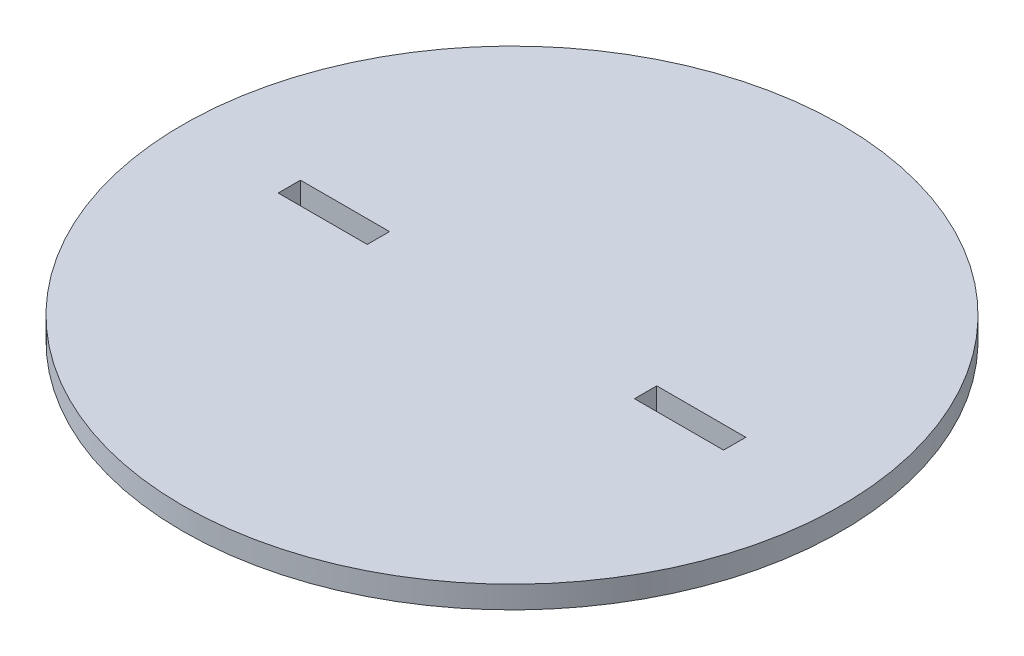
ISO-10303-21;
HEADER;
FILE_DESCRIPTION(('STEP AP214'),'2;1');
FILE_NAME('part.step','',(''),(''),'','','');
FILE_SCHEMA(('AUTOMOTIVE_DESIGN { 1 0 10303 214 1 1 1 1 }'));
ENDSEC;
DATA;
#1=APPLICATION_CONTEXT('core data for automotive mechanical design processes');
#2=APPLICATION_PROTOCOL_DEFINITION('international standard','automotive_design',2000,#1);
#3=PRODUCT_CONTEXT('',#1,'mechanical');
#4=PRODUCT('Part','Part','',(#3));
#5=PRODUCT_RELATED_PRODUCT_CATEGORY('part','',(#4));
#6=PRODUCT_DEFINITION_FORMATION('','',#4);
#7=PRODUCT_DEFINITION_CONTEXT('part definition',#1,'design');
#8=PRODUCT_DEFINITION('design','',#6,#7);
#9=PRODUCT_DEFINITION_SHAPE('','',#8);
#10=(LENGTH_UNIT() NAMED_UNIT(*) SI_UNIT(.MILLI.,.METRE.));
#11=(NAMED_UNIT(*) PLANE_ANGLE_UNIT() SI_UNIT($,.RADIAN.));
#12=(NAMED_UNIT(*) SI_UNIT($,.STERADIAN.) SOLID_ANGLE_UNIT());
#13=UNCERTAINTY_MEASURE_WITH_UNIT(LENGTH_MEASURE(1.E-05),#10,'distance_accuracy_value','');
#14=(GEOMETRIC_REPRESENTATION_CONTEXT(3) GLOBAL_UNCERTAINTY_ASSIGNED_CONTEXT((#13)) GLOBAL_UNIT_ASSIGNED_CONTEXT((#10,
#11,#12)) REPRESENTATION_CONTEXT('',''));
#15=CARTESIAN_POINT('',(0.,0.,0.));
#16=DIRECTION('',(0.,0.,1.));
#17=DIRECTION('',(1.,0.,0.));
#18=AXIS2_PLACEMENT_3D('',#15,#16,#17);
#19=CARTESIAN_POINT('',(0.,1.5875,0.));
#20=DIRECTION('',(0.,-1.,0.));
#21=DIRECTION('',(0.,0.,-1.));
#22=AXIS2_PLACEMENT_3D('',#19,#20,#21);
#23=CYLINDRICAL_SURFACE('',#22,23.495);
#24=CARTESIAN_POINT('',(0.,1.5875,0.));
#25=DIRECTION('',(0.,1.,0.));
#26=DIRECTION('',(0.,0.,1.));
#27=AXIS2_PLACEMENT_3D('',#24,#25,#26);
#28=CIRCLE('',#27,23.495);
#29=CARTESIAN_POINT('',(0.,1.5875,23.495));
#30=VERTEX_POINT('',#29);
#31=EDGE_CURVE('E11',#30,#30,#28,.T.);
#32=ORIENTED_EDGE('',*,*,#31,.F.);
#33=EDGE_LOOP('',(#32));
#34=FACE_BOUND('',#33,.T.);
#35=CARTESIAN_POINT('',(0.,0.,0.));
#36=DIRECTION('',(0.,1.,0.));
#37=DIRECTION('',(0.,0.,1.));
#38=AXIS2_PLACEMENT_3D('',#35,#36,#37);
#39=CIRCLE('',#38,23.495);
#40=CARTESIAN_POINT('',(0.,0.,23.495));
#41=VERTEX_POINT('',#40);
#42=EDGE_CURVE('E40',#41,#41,#39,.T.);
#43=ORIENTED_EDGE('',*,*,#42,.T.);
#44=EDGE_LOOP('',(#43));
#45=FACE_BOUND('',#44,.T.);
#46=ADVANCED_FACE('F37',(#34,#45),#23,.T.);
#47=CARTESIAN_POINT('',(0.,1.5875,0.));
#48=DIRECTION('',(0.,1.,0.));
#49=DIRECTION('',(0.,0.,1.));
#50=AXIS2_PLACEMENT_3D('',#47,#48,#49);
#51=PLANE('',#50);
#52=DIRECTION('',(0.,0.,1.));
#53=VECTOR('',#52,1.);
#54=CARTESIAN_POINT('',(9.52500000000001,1.5875,0.793749999999998));
#55=LINE('',#54,#53);
#56=CARTESIAN_POINT('',(9.52500000000001,1.5875,-0.793749999999998));
#57=VERTEX_POINT('',#56);
#58=CARTESIAN_POINT('',(9.52500000000001,1.5875,0.793749999999998));
#59=VERTEX_POINT('',#58);
#60=EDGE_CURVE('E51',#57,#59,#55,.T.);
#61=ORIENTED_EDGE('',*,*,#60,.F.);
#62=DIRECTION('',(-1.,0.,0.));
#63=VECTOR('',#62,1.);
#64=CARTESIAN_POINT('',(9.52500000000001,1.5875,-0.793749999999998));
#65=LINE('',#64,#63);
#66=CARTESIAN_POINT('',(15.875,1.5875,-0.793750000000001));
#67=VERTEX_POINT('',#66);
#68=EDGE_CURVE('E119',#67,#57,#65,.T.);
#69=ORIENTED_EDGE('',*,*,#68,.F.);
#70=DIRECTION('',(0.,0.,-1.));
#71=VECTOR('',#70,1.);
#72=CARTESIAN_POINT('',(15.875,1.5875,0.793750000000004));
#73=LINE('',#72,#71);
#74=CARTESIAN_POINT('',(15.875,1.5875,0.793750000000004));
#75=VERTEX_POINT('',#74);
#76=EDGE_CURVE('E122',#75,#67,#73,.T.);
#77=ORIENTED_EDGE('',*,*,#76,.F.);
#78=DIRECTION('',(1.,0.,0.));
#79=VECTOR('',#78,1.);
#80=CARTESIAN_POINT('',(9.52500000000001,1.5875,0.793749999999998));
#81=LINE('',#80,#79);
#82=EDGE_CURVE('E128',#59,#75,#81,.T.);
#83=ORIENTED_EDGE('',*,*,#82,.F.);
#84=EDGE_LOOP('',(#61,#69,#77,#83));
#85=FACE_BOUND('',#84,.T.);
#86=DIRECTION('',(0.,0.,-1.));
#87=VECTOR('',#86,1.);
#88=CARTESIAN_POINT('',(-9.52499999999999,1.5875,0.793749999999998));
#89=LINE('',#88,#87);
#90=CARTESIAN_POINT('',(-9.52499999999999,1.5875,0.793749999999998));
#91=VERTEX_POINT('',#90);
#92=CARTESIAN_POINT('',(-9.52499999999999,1.5875,-0.793749999999997));
#93=VERTEX_POINT('',#92);
#94=EDGE_CURVE('E134',#91,#93,#89,.T.);
#95=ORIENTED_EDGE('',*,*,#94,.F.);
#96=DIRECTION('',(1.,0.,0.));
#97=VECTOR('',#96,1.);
#98=CARTESIAN_POINT('',(-9.52499999999999,1.5875,0.793749999999998));
#99=LINE('',#98,#97);
#100=CARTESIAN_POINT('',(-15.875,1.5875,0.793749999999998));
#101=VERTEX_POINT('',#100);
#102=EDGE_CURVE('E142',#101,#91,#99,.T.);
#103=ORIENTED_EDGE('',*,*,#102,.F.);
#104=DIRECTION('',(0.,0.,1.));
#105=VECTOR('',#104,1.);
#106=CARTESIAN_POINT('',(-15.875,1.5875,0.793749999999998));
#107=LINE('',#106,#105);
#108=CARTESIAN_POINT('',(-15.875,1.5875,-0.793750000000001));
#109=VERTEX_POINT('',#108);
#110=EDGE_CURVE('E156',#109,#101,#107,.T.);
#111=ORIENTED_EDGE('',*,*,#110,.F.);
#112=DIRECTION('',(-1.,0.,0.));
#113=VECTOR('',#112,1.);
#114=CARTESIAN_POINT('',(-9.52499999999999,1.5875,-0.793749999999997));
#115=LINE('',#114,#113);
#116=EDGE_CURVE('E153',#93,#109,#115,.T.);
#117=ORIENTED_EDGE('',*,*,#116,.F.);
#118=EDGE_LOOP('',(#95,#103,#111,#117));
#119=FACE_BOUND('',#118,.T.);
#120=ORIENTED_EDGE('',*,*,#31,.T.);
#121=EDGE_LOOP('',(#120));
#122=FACE_BOUND('',#121,.T.);
#123=ADVANCED_FACE('F178',(#85,#119,#122),#51,.T.);
#124=CARTESIAN_POINT('',(0.,0.,0.));
#125=DIRECTION('',(0.,1.,0.));
#126=DIRECTION('',(0.,0.,1.));
#127=AXIS2_PLACEMENT_3D('',#124,#125,#126);
#128=PLANE('',#127);
#129=DIRECTION('',(-1.,0.,0.));
#130=VECTOR('',#129,1.);
#131=CARTESIAN_POINT('',(9.52500000000001,0.,-0.793749999999998));
#132=LINE('',#131,#130);
#133=CARTESIAN_POINT('',(15.875,0.,-0.793750000000001));
#134=VERTEX_POINT('',#133);
#135=CARTESIAN_POINT('',(9.52500000000001,0.,-0.793749999999998));
#136=VERTEX_POINT('',#135);
#137=EDGE_CURVE('E109',#134,#136,#132,.T.);
#138=ORIENTED_EDGE('',*,*,#137,.T.);
#139=DIRECTION('',(0.,0.,1.));
#140=VECTOR('',#139,1.);
#141=CARTESIAN_POINT('',(9.52500000000001,0.,0.793749999999998));
#142=LINE('',#141,#140);
#143=CARTESIAN_POINT('',(9.52500000000001,0.,0.793749999999998));
#144=VERTEX_POINT('',#143);
#145=EDGE_CURVE('E103',#136,#144,#142,.T.);
#146=ORIENTED_EDGE('',*,*,#145,.T.);
#147=DIRECTION('',(1.,0.,0.));
#148=VECTOR('',#147,1.);
#149=CARTESIAN_POINT('',(9.52500000000001,0.,0.793749999999998));
#150=LINE('',#149,#148);
#151=CARTESIAN_POINT('',(15.875,0.,0.793750000000004));
#152=VERTEX_POINT('',#151);
#153=EDGE_CURVE('E112',#144,#152,#150,.T.);
#154=ORIENTED_EDGE('',*,*,#153,.T.);
#155=DIRECTION('',(0.,0.,-1.));
#156=VECTOR('',#155,1.);
#157=CARTESIAN_POINT('',(15.875,0.,0.793750000000004));
#158=LINE('',#157,#156);
#159=EDGE_CURVE('E59',#152,#134,#158,.T.);
#160=ORIENTED_EDGE('',*,*,#159,.T.);
#161=EDGE_LOOP('',(#138,#146,#154,#160));
#162=FACE_BOUND('',#161,.T.);
#163=DIRECTION('',(1.,0.,0.));
#164=VECTOR('',#163,1.);
#165=CARTESIAN_POINT('',(-9.52499999999999,0.,0.793749999999998));
#166=LINE('',#165,#164);
#167=CARTESIAN_POINT('',(-15.875,0.,0.793749999999998));
#168=VERTEX_POINT('',#167);
#169=CARTESIAN_POINT('',(-9.52499999999999,0.,0.793749999999998));
#170=VERTEX_POINT('',#169);
#171=EDGE_CURVE('E148',#168,#170,#166,.T.);
#172=ORIENTED_EDGE('',*,*,#171,.T.);
#173=DIRECTION('',(0.,0.,-1.));
#174=VECTOR('',#173,1.);
#175=CARTESIAN_POINT('',(-9.52499999999999,0.,0.793749999999998));
#176=LINE('',#175,#174);
#177=CARTESIAN_POINT('',(-9.52499999999999,0.,-0.793749999999997));
#178=VERTEX_POINT('',#177);
#179=EDGE_CURVE('E138',#170,#178,#176,.T.);
#180=ORIENTED_EDGE('',*,*,#179,.T.);
#181=DIRECTION('',(-1.,0.,0.));
#182=VECTOR('',#181,1.);
#183=CARTESIAN_POINT('',(-9.52499999999999,0.,-0.793749999999997));
#184=LINE('',#183,#182);
#185=CARTESIAN_POINT('',(-15.875,0.,-0.793750000000001));
#186=VERTEX_POINT('',#185);
#187=EDGE_CURVE('E141',#178,#186,#184,.T.);
#188=ORIENTED_EDGE('',*,*,#187,.T.);
#189=DIRECTION('',(0.,0.,1.));
#190=VECTOR('',#189,1.);
#191=CARTESIAN_POINT('',(-15.875,0.,0.793749999999998));
#192=LINE('',#191,#190);
#193=EDGE_CURVE('E145',#186,#168,#192,.T.);
#194=ORIENTED_EDGE('',*,*,#193,.T.);
#195=EDGE_LOOP('',(#172,#180,#188,#194));
#196=FACE_BOUND('',#195,.T.);
#197=ORIENTED_EDGE('',*,*,#42,.F.);
#198=EDGE_LOOP('',(#197));
#199=FACE_BOUND('',#198,.T.);
#200=ADVANCED_FACE('F116',(#162,#196,#199),#128,.F.);
#201=CARTESIAN_POINT('',(-9.52499999999999,0.,0.793749999999998));
#202=DIRECTION('',(1.,0.,0.));
#203=DIRECTION('',(0.,0.,-1.));
#204=AXIS2_PLACEMENT_3D('',#201,#202,#203);
#205=PLANE('',#204);
#206=ORIENTED_EDGE('',*,*,#94,.T.);
#207=DIRECTION('',(0.,1.,0.));
#208=VECTOR('',#207,1.);
#209=CARTESIAN_POINT('',(-9.52499999999999,0.,-0.793749999999997));
#210=LINE('',#209,#208);
#211=EDGE_CURVE('E151',#178,#93,#210,.T.);
#212=ORIENTED_EDGE('',*,*,#211,.F.);
#213=ORIENTED_EDGE('',*,*,#179,.F.);
#214=DIRECTION('',(0.,1.,0.));
#215=VECTOR('',#214,1.);
#216=CARTESIAN_POINT('',(-9.52499999999999,0.,0.793749999999998));
#217=LINE('',#216,#215);
#218=EDGE_CURVE('E161',#170,#91,#217,.T.);
#219=ORIENTED_EDGE('',*,*,#218,.T.);
#220=EDGE_LOOP('',(#206,#212,#213,#219));
#221=FACE_BOUND('',#220,.T.);
#222=ADVANCED_FACE('F185',(#221),#205,.F.);
#223=CARTESIAN_POINT('',(-9.52499999999999,0.,0.793749999999998));
#224=DIRECTION('',(0.,0.,1.));
#225=DIRECTION('',(1.,0.,0.));
#226=AXIS2_PLACEMENT_3D('',#223,#224,#225);
#227=PLANE('',#226);
#228=ORIENTED_EDGE('',*,*,#102,.T.);
#229=ORIENTED_EDGE('',*,*,#218,.F.);
#230=ORIENTED_EDGE('',*,*,#171,.F.);
#231=DIRECTION('',(0.,1.,0.));
#232=VECTOR('',#231,1.);
#233=CARTESIAN_POINT('',(-15.875,0.,0.793749999999998));
#234=LINE('',#233,#232);
#235=EDGE_CURVE('E163',#168,#101,#234,.T.);
#236=ORIENTED_EDGE('',*,*,#235,.T.);
#237=EDGE_LOOP('',(#228,#229,#230,#236));
#238=FACE_BOUND('',#237,.T.);
#239=ADVANCED_FACE('F187',(#238),#227,.F.);
#240=CARTESIAN_POINT('',(-15.875,0.,0.793749999999998));
#241=DIRECTION('',(-1.,0.,0.));
#242=DIRECTION('',(0.,0.,1.));
#243=AXIS2_PLACEMENT_3D('',#240,#241,#242);
#244=PLANE('',#243);
#245=ORIENTED_EDGE('',*,*,#110,.T.);
#246=ORIENTED_EDGE('',*,*,#235,.F.);
#247=ORIENTED_EDGE('',*,*,#193,.F.);
#248=DIRECTION('',(0.,1.,0.));
#249=VECTOR('',#248,1.);
#250=CARTESIAN_POINT('',(-15.875,0.,-0.793750000000001));
#251=LINE('',#250,#249);
#252=EDGE_CURVE('E165',#186,#109,#251,.T.);
#253=ORIENTED_EDGE('',*,*,#252,.T.);
#254=EDGE_LOOP('',(#245,#246,#247,#253));
#255=FACE_BOUND('',#254,.T.);
#256=ADVANCED_FACE('F182',(#255),#244,.F.);
#257=CARTESIAN_POINT('',(-9.52499999999999,0.,-0.793749999999997));
#258=DIRECTION('',(0.,0.,-1.));
#259=DIRECTION('',(-1.,0.,0.));
#260=AXIS2_PLACEMENT_3D('',#257,#258,#259);
#261=PLANE('',#260);
#262=ORIENTED_EDGE('',*,*,#116,.T.);
#263=ORIENTED_EDGE('',*,*,#252,.F.);
#264=ORIENTED_EDGE('',*,*,#187,.F.);
#265=ORIENTED_EDGE('',*,*,#211,.T.);
#266=EDGE_LOOP('',(#262,#263,#264,#265));
#267=FACE_BOUND('',#266,.T.);
#268=ADVANCED_FACE('F171',(#267),#261,.F.);
#269=CARTESIAN_POINT('',(9.52500000000001,0.,0.793749999999998));
#270=DIRECTION('',(-1.,0.,0.));
#271=DIRECTION('',(0.,0.,1.));
#272=AXIS2_PLACEMENT_3D('',#269,#270,#271);
#273=PLANE('',#272);
#274=ORIENTED_EDGE('',*,*,#60,.T.);
#275=DIRECTION('',(0.,1.,0.));
#276=VECTOR('',#275,1.);
#277=CARTESIAN_POINT('',(9.52500000000001,0.,0.793749999999998));
#278=LINE('',#277,#276);
#279=EDGE_CURVE('E99',#144,#59,#278,.T.);
#280=ORIENTED_EDGE('',*,*,#279,.F.);
#281=ORIENTED_EDGE('',*,*,#145,.F.);
#282=DIRECTION('',(0.,1.,0.));
#283=VECTOR('',#282,1.);
#284=CARTESIAN_POINT('',(9.52500000000001,0.,-0.793749999999998));
#285=LINE('',#284,#283);
#286=EDGE_CURVE('E132',#136,#57,#285,.T.);
#287=ORIENTED_EDGE('',*,*,#286,.T.);
#288=EDGE_LOOP('',(#274,#280,#281,#287));
#289=FACE_BOUND('',#288,.T.);
#290=ADVANCED_FACE('F101',(#289),#273,.F.);
#291=CARTESIAN_POINT('',(9.52500000000001,0.,-0.793749999999998));
#292=DIRECTION('',(0.,0.,-1.));
#293=DIRECTION('',(-1.,0.,0.));
#294=AXIS2_PLACEMENT_3D('',#291,#292,#293);
#295=PLANE('',#294);
#296=ORIENTED_EDGE('',*,*,#68,.T.);
#297=ORIENTED_EDGE('',*,*,#286,.F.);
#298=ORIENTED_EDGE('',*,*,#137,.F.);
#299=DIRECTION('',(0.,1.,0.));
#300=VECTOR('',#299,1.);
#301=CARTESIAN_POINT('',(15.875,0.,-0.793750000000001));
#302=LINE('',#301,#300);
#303=EDGE_CURVE('E135',#134,#67,#302,.T.);
#304=ORIENTED_EDGE('',*,*,#303,.T.);
#305=EDGE_LOOP('',(#296,#297,#298,#304));
#306=FACE_BOUND('',#305,.T.);
#307=ADVANCED_FACE('F216',(#306),#295,.F.);
#308=CARTESIAN_POINT('',(15.875,0.,0.793750000000004));
#309=DIRECTION('',(1.,0.,0.));
#310=DIRECTION('',(0.,0.,-1.));
#311=AXIS2_PLACEMENT_3D('',#308,#309,#310);
#312=PLANE('',#311);
#313=ORIENTED_EDGE('',*,*,#76,.T.);
#314=ORIENTED_EDGE('',*,*,#303,.F.);
#315=ORIENTED_EDGE('',*,*,#159,.F.);
#316=DIRECTION('',(0.,1.,0.));
#317=VECTOR('',#316,1.);
#318=CARTESIAN_POINT('',(15.875,0.,0.793750000000004));
#319=LINE('',#318,#317);
#320=EDGE_CURVE('E108',#152,#75,#319,.T.);
#321=ORIENTED_EDGE('',*,*,#320,.T.);
#322=EDGE_LOOP('',(#313,#314,#315,#321));
#323=FACE_BOUND('',#322,.T.);
#324=ADVANCED_FACE('F220',(#323),#312,.F.);
#325=CARTESIAN_POINT('',(9.52500000000001,0.,0.793749999999998));
#326=DIRECTION('',(0.,0.,1.));
#327=DIRECTION('',(1.,0.,0.));
#328=AXIS2_PLACEMENT_3D('',#325,#326,#327);
#329=PLANE('',#328);
#330=ORIENTED_EDGE('',*,*,#82,.T.);
#331=ORIENTED_EDGE('',*,*,#320,.F.);
#332=ORIENTED_EDGE('',*,*,#153,.F.);
#333=ORIENTED_EDGE('',*,*,#279,.T.);
#334=EDGE_LOOP('',(#330,#331,#332,#333));
#335=FACE_BOUND('',#334,.T.);
#336=ADVANCED_FACE('F113',(#335),#329,.F.);
#337=CLOSED_SHELL('',(#46,#123,#200,#222,#239,#256,#268,#290,#307,#324,#336));
#338=MANIFOLD_SOLID_BREP('B2',#337);
#339=ADVANCED_BREP_SHAPE_REPRESENTATION('',(#18,#338),#14);
#340=SHAPE_DEFINITION_REPRESENTATION(#9,#339);
ENDSEC;
END-ISO-10303-21;
